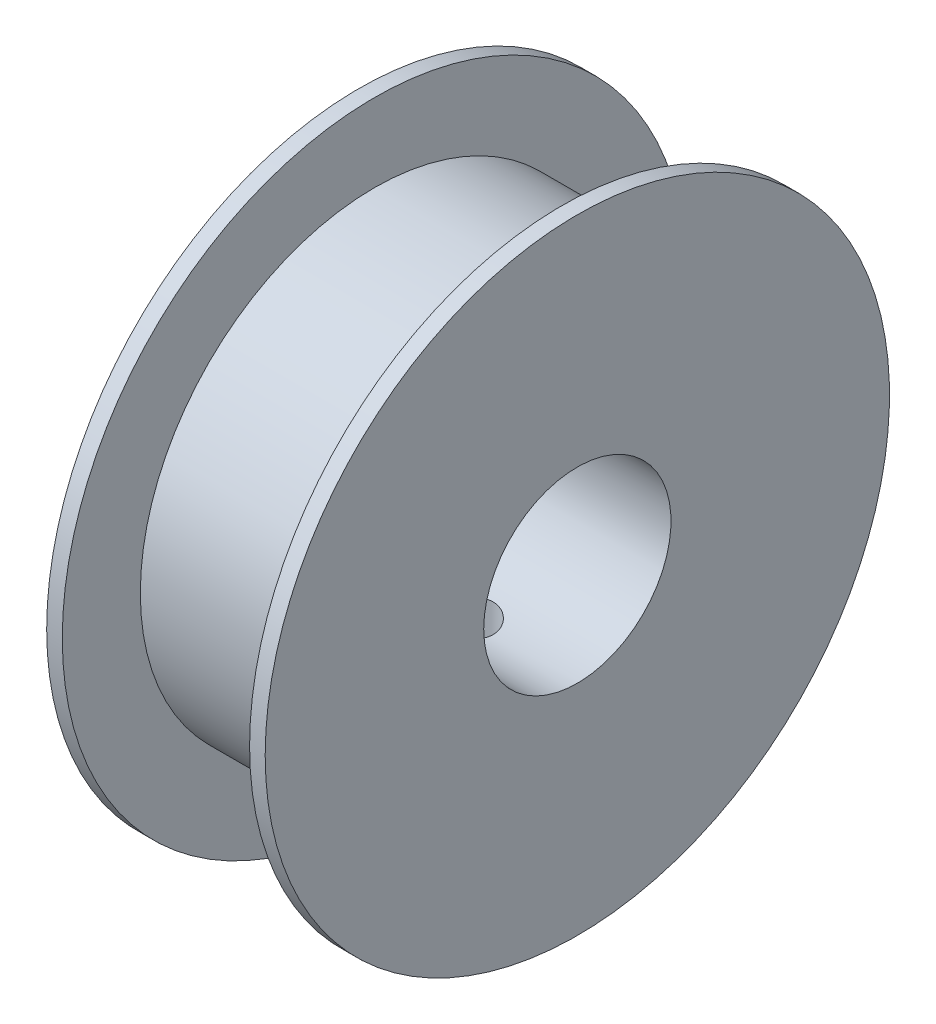
ISO-10303-21;
HEADER;
FILE_DESCRIPTION(('STEP AP214'),'2;1');
FILE_NAME('part.step','',(''),(''),'','','');
FILE_SCHEMA(('AUTOMOTIVE_DESIGN { 1 0 10303 214 1 1 1 1 }'));
ENDSEC;
DATA;
#1=APPLICATION_CONTEXT('core data for automotive mechanical design processes');
#2=APPLICATION_PROTOCOL_DEFINITION('international standard','automotive_design',2000,#1);
#3=PRODUCT_CONTEXT('',#1,'mechanical');
#4=PRODUCT('Part','Part','',(#3));
#5=PRODUCT_RELATED_PRODUCT_CATEGORY('part','',(#4));
#6=PRODUCT_DEFINITION_FORMATION('','',#4);
#7=PRODUCT_DEFINITION_CONTEXT('part definition',#1,'design');
#8=PRODUCT_DEFINITION('design','',#6,#7);
#9=PRODUCT_DEFINITION_SHAPE('','',#8);
#10=(LENGTH_UNIT() NAMED_UNIT(*) SI_UNIT(.MILLI.,.METRE.));
#11=(NAMED_UNIT(*) PLANE_ANGLE_UNIT() SI_UNIT($,.RADIAN.));
#12=(NAMED_UNIT(*) SI_UNIT($,.STERADIAN.) SOLID_ANGLE_UNIT());
#13=UNCERTAINTY_MEASURE_WITH_UNIT(LENGTH_MEASURE(1.E-05),#10,'distance_accuracy_value','');
#14=(GEOMETRIC_REPRESENTATION_CONTEXT(3) GLOBAL_UNCERTAINTY_ASSIGNED_CONTEXT((#13)) GLOBAL_UNIT_ASSIGNED_CONTEXT((#10,
#11,#12)) REPRESENTATION_CONTEXT('',''));
#15=CARTESIAN_POINT('',(0.,0.,0.));
#16=DIRECTION('',(0.,0.,1.));
#17=DIRECTION('',(1.,0.,0.));
#18=AXIS2_PLACEMENT_3D('',#15,#16,#17);
#19=CARTESIAN_POINT('',(-49.8494068842632,0.,20.0560361776407));
#20=DIRECTION('',(-1.,0.,0.));
#21=DIRECTION('',(0.,0.,1.));
#22=AXIS2_PLACEMENT_3D('',#19,#20,#21);
#23=CYLINDRICAL_SURFACE('',#22,20.);
#24=CARTESIAN_POINT('',(-44.7308545798672,0.,20.0560361776407));
#25=DIRECTION('',(-1.,0.,0.));
#26=DIRECTION('',(0.,0.,1.));
#27=AXIS2_PLACEMENT_3D('',#24,#25,#26);
#28=CIRCLE('',#27,20.);
#29=CARTESIAN_POINT('',(-44.7308545798672,0.,40.0560361776407));
#30=VERTEX_POINT('',#29);
#31=EDGE_CURVE('E65',#30,#30,#28,.T.);
#32=ORIENTED_EDGE('',*,*,#31,.F.);
#33=EDGE_LOOP('',(#32));
#34=FACE_BOUND('',#33,.T.);
#35=CARTESIAN_POINT('',(-43.7308545798672,0.,20.0560361776407));
#36=DIRECTION('',(-1.,0.,0.));
#37=DIRECTION('',(0.,0.,1.));
#38=AXIS2_PLACEMENT_3D('',#35,#36,#37);
#39=CIRCLE('',#38,20.);
#40=CARTESIAN_POINT('',(-43.7308545798672,0.,40.0560361776407));
#41=VERTEX_POINT('',#40);
#42=EDGE_CURVE('E10',#41,#41,#39,.T.);
#43=ORIENTED_EDGE('',*,*,#42,.T.);
#44=EDGE_LOOP('',(#43));
#45=FACE_BOUND('',#44,.T.);
#46=ADVANCED_FACE('F33',(#34,#45),#23,.T.);
#47=CARTESIAN_POINT('',(-43.7308545798672,0.,0.0560361776407448));
#48=DIRECTION('',(-1.,0.,0.));
#49=DIRECTION('',(0.,0.,1.));
#50=AXIS2_PLACEMENT_3D('',#47,#48,#49);
#51=PLANE('',#50);
#52=ORIENTED_EDGE('',*,*,#42,.F.);
#53=EDGE_LOOP('',(#52));
#54=FACE_BOUND('',#53,.T.);
#55=CARTESIAN_POINT('',(-43.7308545798672,0.,20.0560361776407));
#56=DIRECTION('',(-1.,0.,0.));
#57=DIRECTION('',(0.,0.,1.));
#58=AXIS2_PLACEMENT_3D('',#55,#56,#57);
#59=CIRCLE('',#58,15.);
#60=CARTESIAN_POINT('',(-43.7308545798672,0.,35.0560361776407));
#61=VERTEX_POINT('',#60);
#62=EDGE_CURVE('E44',#61,#61,#59,.T.);
#63=ORIENTED_EDGE('',*,*,#62,.T.);
#64=EDGE_LOOP('',(#63));
#65=FACE_BOUND('',#64,.T.);
#66=ADVANCED_FACE('F103',(#54,#65),#51,.F.);
#67=CARTESIAN_POINT('',(-49.8494068842632,0.,20.0560361776407));
#68=DIRECTION('',(-1.,0.,0.));
#69=DIRECTION('',(0.,0.,1.));
#70=AXIS2_PLACEMENT_3D('',#67,#68,#69);
#71=CYLINDRICAL_SURFACE('',#70,15.);
#72=CARTESIAN_POINT('',(-37.7308545798672,-14.9144225500017,21.6560361776407));
#73=CARTESIAN_POINT('',(-37.6412565888924,-14.9144236655933,21.6560323127364));
#74=CARTESIAN_POINT('',(-37.5516001486898,-14.9152386417625,21.6484847560006));
#75=CARTESIAN_POINT('',(-37.3747753240401,-14.9184098476283,21.6184913808744));
#76=CARTESIAN_POINT('',(-37.2876097544806,-14.9207677542496,21.5960293523893));
#77=CARTESIAN_POINT('',(-37.1183528283659,-14.9267547699762,21.5368705670349));
#78=CARTESIAN_POINT('',(-37.0362583425626,-14.9303830857339,21.5001826924183));
#79=CARTESIAN_POINT('',(-36.8794093412271,-14.9385011292845,21.4136312202387));
#80=CARTESIAN_POINT('',(-36.8046534216364,-14.9429906918111,21.3637701498155));
#81=CARTESIAN_POINT('',(-36.6642787395788,-14.9523460689031,21.2520673578389));
#82=CARTESIAN_POINT('',(-36.5986944731294,-14.9572132022761,21.1901823919092));
#83=CARTESIAN_POINT('',(-36.4788220851314,-14.9667633778283,21.0562811269401));
#84=CARTESIAN_POINT('',(-36.4245344912235,-14.9714464114003,20.9842643549312));
#85=CARTESIAN_POINT('',(-36.3286759368629,-14.9801139039792,20.8319308435279));
#86=CARTESIAN_POINT('',(-36.2871357055182,-14.9840966651839,20.7515946624799));
#87=CARTESIAN_POINT('',(-36.2181476904811,-14.9909004707378,20.585037492711));
#88=CARTESIAN_POINT('',(-36.1906995194533,-14.9937215470167,20.4988166658096));
#89=CARTESIAN_POINT('',(-36.1507764975354,-14.9978748574594,20.3232875577804));
#90=CARTESIAN_POINT('',(-36.1382447767579,-14.9992127450233,20.2339923472546));
#91=CARTESIAN_POINT('',(-36.1283343494322,-15.0002681826757,20.0545568302117));
#92=CARTESIAN_POINT('',(-36.1309552000684,-14.9999857801152,19.9644165484678));
#93=CARTESIAN_POINT('',(-36.1512295000159,-14.9978370703299,19.7862359121619));
#94=CARTESIAN_POINT('',(-36.168821795094,-14.9959772067036,19.6981885105843));
#95=CARTESIAN_POINT('',(-36.2184442527998,-14.9908899262437,19.5263031148105));
#96=CARTESIAN_POINT('',(-36.250474624907,-14.9876624895682,19.4424651817084));
#97=CARTESIAN_POINT('',(-36.3281305677545,-14.9801917630767,19.2811866509887));
#98=CARTESIAN_POINT('',(-36.3737830534523,-14.9759464654356,19.203759109756));
#99=CARTESIAN_POINT('',(-36.4773677663219,-14.9669160371749,19.0576417042459));
#100=CARTESIAN_POINT('',(-36.5353004035534,-14.962130888531,18.9889521318701));
#101=CARTESIAN_POINT('',(-36.662144514172,-14.9525292725756,18.8619020477762));
#102=CARTESIAN_POINT('',(-36.7311092110492,-14.9477127679481,18.803594663104));
#103=CARTESIAN_POINT('',(-36.877875674098,-14.9386149965148,18.699375784939));
#104=CARTESIAN_POINT('',(-36.9556774561651,-14.9343337306718,18.6534643137436));
#105=CARTESIAN_POINT('',(-37.1179520033578,-14.9267909175718,18.5753399745346));
#106=CARTESIAN_POINT('',(-37.2024264760579,-14.9235296323989,18.5431306265151));
#107=CARTESIAN_POINT('',(-37.3756272299974,-14.9184013871239,18.4933681173521));
#108=CARTESIAN_POINT('',(-37.4643533633038,-14.9165343785466,18.4758144466671));
#109=CARTESIAN_POINT('',(-37.6430717421569,-14.9144146003332,18.4559304092112));
#110=CARTESIAN_POINT('',(-37.7330556165361,-14.914153938196,18.4535256098236));
#111=CARTESIAN_POINT('',(-37.9121450214029,-14.9152555286042,18.4638118773613));
#112=CARTESIAN_POINT('',(-38.0012505654055,-14.9166177561386,18.4765027116408));
#113=CARTESIAN_POINT('',(-38.1758354801393,-14.9208044527218,18.5165576276903));
#114=CARTESIAN_POINT('',(-38.2613230649851,-14.9236253932699,18.5438863074639));
#115=CARTESIAN_POINT('',(-38.4265011121702,-14.9304088072498,18.6124049388579));
#116=CARTESIAN_POINT('',(-38.5061914240119,-14.9343713103036,18.6535952501712));
#117=CARTESIAN_POINT('',(-38.6578514629253,-14.9430104351993,18.7488535148471));
#118=CARTESIAN_POINT('',(-38.7297901321486,-14.9476897601603,18.8029706661976));
#119=CARTESIAN_POINT('',(-38.8635893871637,-14.9572265334338,18.9224761470013));
#120=CARTESIAN_POINT('',(-38.9254496886995,-14.9620839867655,18.9878647942552));
#121=CARTESIAN_POINT('',(-39.037594077137,-14.9714536371823,19.1283805843653));
#122=CARTESIAN_POINT('',(-39.0878295202163,-14.9759643325541,19.2035466635937));
#123=CARTESIAN_POINT('',(-39.1749630080714,-14.9841102341174,19.3612920433897));
#124=CARTESIAN_POINT('',(-39.2118612572873,-14.9877454537285,19.4438712303009));
#125=CARTESIAN_POINT('',(-39.2711910403719,-14.9937240629098,19.6139309143894));
#126=CARTESIAN_POINT('',(-39.2936516420748,-14.9960700467537,19.7014011755621));
#127=CARTESIAN_POINT('',(-39.3235633531027,-14.9992165342767,19.8788978045657));
#128=CARTESIAN_POINT('',(-39.3310149465423,-15.0000170878034,19.9689240898571));
#129=CARTESIAN_POINT('',(-39.3306897683637,-14.9999824379928,20.1485001655406));
#130=CARTESIAN_POINT('',(-39.3229883842556,-14.9991553324116,20.2380501035077));
#131=CARTESIAN_POINT('',(-39.2927343370414,-14.9959742980279,20.4145760913493));
#132=CARTESIAN_POINT('',(-39.2701816669227,-14.9936203685045,20.5015521400084));
#133=CARTESIAN_POINT('',(-39.2108868324186,-14.9876492980642,20.6704585051961));
#134=CARTESIAN_POINT('',(-39.1741472288251,-14.9840323851316,20.7523897292405));
#135=CARTESIAN_POINT('',(-39.0875293559588,-14.9759378682743,20.9089348387753));
#136=CARTESIAN_POINT('',(-39.0376511055162,-14.9714602655833,20.9835487347525));
#137=CARTESIAN_POINT('',(-38.9258898303516,-14.9621189097809,21.1237273565908));
#138=CARTESIAN_POINT('',(-38.8639506378233,-14.9572534154219,21.1892471864386));
#139=CARTESIAN_POINT('',(-38.7299386060694,-14.9476992164899,21.3089953406162));
#140=CARTESIAN_POINT('',(-38.6578633473456,-14.9430105544671,21.3632209613069));
#141=CARTESIAN_POINT('',(-38.5053963885181,-14.9343265816053,21.458966837947));
#142=CARTESIAN_POINT('',(-38.4249815241576,-14.9303332892578,21.5004503644136));
#143=CARTESIAN_POINT('',(-38.258334463341,-14.9235160982773,21.569269161836));
#144=CARTESIAN_POINT('',(-38.1721088938709,-14.9206908928619,21.5966202518801));
#145=CARTESIAN_POINT('',(-38.0263131951117,-14.9172357939645,21.6296435128485));
#146=CARTESIAN_POINT('',(-37.9676723529666,-14.9161858805251,21.6395270656153));
#147=CARTESIAN_POINT('',(-37.8496477639283,-14.9147788904034,21.6527246630897));
#148=CARTESIAN_POINT('',(-37.7902640207155,-14.9144218102902,21.65603874033));
#149=CARTESIAN_POINT('',(-37.7308545798672,-14.9144225500017,21.6560361776407));
#150=B_SPLINE_CURVE_WITH_KNOTS('',3,(#72,#73,#74,#75,#76,#77,#78,#79,#80,#81,#82,#83,#84,#85,
#86,#87,#88,#89,#90,#91,#92,#93,#94,#95,#96,#97,#98,#99,#100,#101,#102,#103,#104,#105,#106,#107,
#108,#109,#110,#111,#112,#113,#114,#115,#116,#117,#118,#119,#120,#121,#122,#123,#124,#125,#126,
#127,#128,#129,#130,#131,#132,#133,#134,#135,#136,#137,#138,#139,#140,#141,#142,#143,#144,#145,
#146,#147,#148,#149),.UNSPECIFIED.,.T.,.F.,(4,2,2,2,2,2,2,2,2,2,2,2,2,2,2,2,2,2,2,2,2,2,2,2,2,2,
2,2,2,2,2,2,2,2,2,2,2,2,4),(0.,0.268577001529124,0.537446390261954,0.806148173479042,
1.07479844645294,1.34443343913401,1.61408102300266,1.88437361023824,2.15465876779301,
2.42391011167973,2.69315358705864,2.96130252668383,3.22945535696219,3.49814155961667,
3.76683673567383,4.03686964273638,4.30690303552161,4.57700575645424,4.84709908619821,
5.11586429481954,5.3846253614294,5.65273933841567,5.92086027317743,6.19001837516274,
6.4591840673222,6.72945648996832,6.99972476955153,7.26944718972389,7.53916090987708,
7.80753617116474,8.07591155917663,8.34423852710792,8.61256511047858,8.88217254048789,
9.15184443588199,9.42228652782287,9.69242524206731,9.87051058001084,10.0485950360567),.UNSPECIFIED.);
#151=CARTESIAN_POINT('',(-37.7308545798672,-14.9144225500017,21.6560361776407));
#152=VERTEX_POINT('',#151);
#153=EDGE_CURVE('E68',#152,#152,#150,.T.);
#154=ORIENTED_EDGE('',*,*,#153,.T.);
#155=EDGE_LOOP('',(#154));
#156=FACE_BOUND('',#155,.T.);
#157=ORIENTED_EDGE('',*,*,#62,.F.);
#158=EDGE_LOOP('',(#157));
#159=FACE_BOUND('',#158,.T.);
#160=CARTESIAN_POINT('',(-31.7308545798672,0.,20.0560361776407));
#161=DIRECTION('',(-1.,0.,0.));
#162=DIRECTION('',(0.,0.,1.));
#163=AXIS2_PLACEMENT_3D('',#160,#161,#162);
#164=CIRCLE('',#163,15.);
#165=CARTESIAN_POINT('',(-31.7308545798672,0.,35.0560361776407));
#166=VERTEX_POINT('',#165);
#167=EDGE_CURVE('E48',#166,#166,#164,.T.);
#168=ORIENTED_EDGE('',*,*,#167,.T.);
#169=EDGE_LOOP('',(#168));
#170=FACE_BOUND('',#169,.T.);
#171=ADVANCED_FACE('F73',(#156,#159,#170),#71,.T.);
#172=CARTESIAN_POINT('',(-31.7308545798672,0.,5.05603617764075));
#173=DIRECTION('',(1.,0.,0.));
#174=DIRECTION('',(0.,0.,-1.));
#175=AXIS2_PLACEMENT_3D('',#172,#173,#174);
#176=PLANE('',#175);
#177=ORIENTED_EDGE('',*,*,#167,.F.);
#178=EDGE_LOOP('',(#177));
#179=FACE_BOUND('',#178,.T.);
#180=CARTESIAN_POINT('',(-31.7308545798672,0.,20.0560361776407));
#181=DIRECTION('',(-1.,0.,0.));
#182=DIRECTION('',(0.,0.,1.));
#183=AXIS2_PLACEMENT_3D('',#180,#181,#182);
#184=CIRCLE('',#183,20.);
#185=CARTESIAN_POINT('',(-31.7308545798672,0.,40.0560361776407));
#186=VERTEX_POINT('',#185);
#187=EDGE_CURVE('E53',#186,#186,#184,.T.);
#188=ORIENTED_EDGE('',*,*,#187,.T.);
#189=EDGE_LOOP('',(#188));
#190=FACE_BOUND('',#189,.T.);
#191=ADVANCED_FACE('F96',(#179,#190),#176,.F.);
#192=CARTESIAN_POINT('',(-49.8494068842632,0.,20.0560361776407));
#193=DIRECTION('',(-1.,0.,0.));
#194=DIRECTION('',(0.,0.,1.));
#195=AXIS2_PLACEMENT_3D('',#192,#193,#194);
#196=CYLINDRICAL_SURFACE('',#195,20.);
#197=ORIENTED_EDGE('',*,*,#187,.F.);
#198=EDGE_LOOP('',(#197));
#199=FACE_BOUND('',#198,.T.);
#200=CARTESIAN_POINT('',(-30.7308545798672,0.,20.0560361776407));
#201=DIRECTION('',(-1.,0.,0.));
#202=DIRECTION('',(0.,0.,1.));
#203=AXIS2_PLACEMENT_3D('',#200,#201,#202);
#204=CIRCLE('',#203,20.);
#205=CARTESIAN_POINT('',(-30.7308545798672,0.,40.0560361776407));
#206=VERTEX_POINT('',#205);
#207=EDGE_CURVE('E56',#206,#206,#204,.T.);
#208=ORIENTED_EDGE('',*,*,#207,.T.);
#209=EDGE_LOOP('',(#208));
#210=FACE_BOUND('',#209,.T.);
#211=ADVANCED_FACE('F93',(#199,#210),#196,.T.);
#212=CARTESIAN_POINT('',(-30.7308545798672,0.,0.0560361776407448));
#213=DIRECTION('',(-1.,0.,0.));
#214=DIRECTION('',(0.,0.,1.));
#215=AXIS2_PLACEMENT_3D('',#212,#213,#214);
#216=PLANE('',#215);
#217=ORIENTED_EDGE('',*,*,#207,.F.);
#218=EDGE_LOOP('',(#217));
#219=FACE_BOUND('',#218,.T.);
#220=CARTESIAN_POINT('',(-30.7308545798672,0.,20.0560361776407));
#221=DIRECTION('',(-1.,0.,0.));
#222=DIRECTION('',(0.,0.,1.));
#223=AXIS2_PLACEMENT_3D('',#220,#221,#222);
#224=CIRCLE('',#223,6.);
#225=CARTESIAN_POINT('',(-30.7308545798672,0.,26.0560361776408));
#226=VERTEX_POINT('',#225);
#227=EDGE_CURVE('E59',#226,#226,#224,.T.);
#228=ORIENTED_EDGE('',*,*,#227,.T.);
#229=EDGE_LOOP('',(#228));
#230=FACE_BOUND('',#229,.T.);
#231=ADVANCED_FACE('F89',(#219,#230),#216,.F.);
#232=CARTESIAN_POINT('',(-49.8494068842632,0.,20.0560361776407));
#233=DIRECTION('',(-1.,0.,0.));
#234=DIRECTION('',(0.,0.,1.));
#235=AXIS2_PLACEMENT_3D('',#232,#233,#234);
#236=CYLINDRICAL_SURFACE('',#235,6.);
#237=CARTESIAN_POINT('',(-37.7308545798672,-5.78273291792039,21.6560361776407));
#238=CARTESIAN_POINT('',(-37.8189953300582,-5.78273444556331,21.6560340521669));
#239=CARTESIAN_POINT('',(-37.9071585802477,-5.78477011639345,21.6487281234385));
#240=CARTESIAN_POINT('',(-38.0809389171126,-5.79266848924472,21.6197528437229));
#241=CARTESIAN_POINT('',(-38.1665547038497,-5.79853311126453,21.5980762866084));
#242=CARTESIAN_POINT('',(-38.3327010358245,-5.81337900141366,21.5411229421213));
#243=CARTESIAN_POINT('',(-38.4132385469299,-5.82235588547335,21.5058652779781));
#244=CARTESIAN_POINT('',(-38.5672679719151,-5.8424092393635,21.4228104541504));
#245=CARTESIAN_POINT('',(-38.6407593378728,-5.85348587227547,21.3750123203723));
#246=CARTESIAN_POINT('',(-38.7804486174574,-5.87680111642766,21.2669549606372));
#247=CARTESIAN_POINT('',(-38.8464441938388,-5.88906032893152,21.2064385576744));
#248=CARTESIAN_POINT('',(-38.9674798414282,-5.91318161149208,21.0752155959129));
#249=CARTESIAN_POINT('',(-39.0225187767806,-5.92504364026752,21.0045079819181));
#250=CARTESIAN_POINT('',(-39.1209225305896,-5.94726390774734,20.8535067143394));
#251=CARTESIAN_POINT('',(-39.1640861947735,-5.95759501009834,20.7730776335443));
#252=CARTESIAN_POINT('',(-39.236202288161,-5.97535300969468,20.605782613424));
#253=CARTESIAN_POINT('',(-39.2651571136925,-5.9827803966101,20.5189177623408));
#254=CARTESIAN_POINT('',(-39.3073787560558,-5.99374842861169,20.3433289470888));
#255=CARTESIAN_POINT('',(-39.3209897611679,-5.99737421400212,20.2546931570015));
#256=CARTESIAN_POINT('',(-39.3332202759529,-6.000628196942,20.0763270204476));
#257=CARTESIAN_POINT('',(-39.3318422947713,-6.00025706357286,19.9865968596899));
#258=CARTESIAN_POINT('',(-39.3143763298356,-5.99562140687813,19.8109847879517));
#259=CARTESIAN_POINT('',(-39.2986602137582,-5.99145531221602,19.7250628970639));
#260=CARTESIAN_POINT('',(-39.2535648696417,-5.97981398872374,19.5571231251839));
#261=CARTESIAN_POINT('',(-39.2241848625184,-5.97233857120463,19.4751054670963));
#262=CARTESIAN_POINT('',(-39.1523107017933,-5.95477255279923,19.3163530215227));
#263=CARTESIAN_POINT('',(-39.1096891341867,-5.94465670302171,19.2396788285771));
#264=CARTESIAN_POINT('',(-39.0126395242599,-5.9228997480757,19.0944441786291));
#265=CARTESIAN_POINT('',(-38.9582091806447,-5.91125834578275,19.0258853071721));
#266=CARTESIAN_POINT('',(-38.8371130935201,-5.88729018351104,18.8966078820683));
#267=CARTESIAN_POINT('',(-38.7701230238277,-5.87495335495478,18.8361946414986));
#268=CARTESIAN_POINT('',(-38.6268348388762,-5.85130724018329,18.7273855208026));
#269=CARTESIAN_POINT('',(-38.550536156507,-5.83999801664632,18.6789903734023));
#270=CARTESIAN_POINT('',(-38.3901344984101,-5.81964721826454,18.5953587441505));
#271=CARTESIAN_POINT('',(-38.3059862991363,-5.81062005680583,18.5602052448365));
#272=CARTESIAN_POINT('',(-38.1326733803037,-5.79603460063156,18.5046441641554));
#273=CARTESIAN_POINT('',(-38.0435099107085,-5.79047544571885,18.4842329259503));
#274=CARTESIAN_POINT('',(-37.8655528110499,-5.78363868515234,18.4592621208986));
#275=CARTESIAN_POINT('',(-37.7768277409786,-5.78223810662158,18.454247116671));
#276=CARTESIAN_POINT('',(-37.5998067616252,-5.78354062803713,18.4589563286567));
#277=CARTESIAN_POINT('',(-37.5115108076735,-5.78624329125357,18.468678976263));
#278=CARTESIAN_POINT('',(-37.3396093045891,-5.79532899431386,18.5021860026814));
#279=CARTESIAN_POINT('',(-37.2559462295161,-5.80164031753083,18.5256965943375));
#280=CARTESIAN_POINT('',(-37.0937508747806,-5.81716215168585,18.5858042838368));
#281=CARTESIAN_POINT('',(-37.0152192667256,-5.82637304120572,18.6224030906275));
#282=CARTESIAN_POINT('',(-36.8636106139187,-5.84690857976629,18.7085729335711));
#283=CARTESIAN_POINT('',(-36.7906913991553,-5.8582752389782,18.7584114157374));
#284=CARTESIAN_POINT('',(-36.6540839385048,-5.88174273547405,18.8693143537406));
#285=CARTESIAN_POINT('',(-36.5903974319039,-5.89384371048319,18.930380919857));
#286=CARTESIAN_POINT('',(-36.4721726012672,-5.91783971907433,19.0641131516369));
#287=CARTESIAN_POINT('',(-36.4179518782843,-5.92971869219044,19.1370630448337));
#288=CARTESIAN_POINT('',(-36.3225257899388,-5.95157336013737,19.2912934288881));
#289=CARTESIAN_POINT('',(-36.2813197318041,-5.96154915626333,19.3725734760256));
#290=CARTESIAN_POINT('',(-36.213470873978,-5.978409207194,19.54058486978));
#291=CARTESIAN_POINT('',(-36.1867193643124,-5.98531646784308,19.6272698953349));
#292=CARTESIAN_POINT('',(-36.1482235974157,-5.99536243029798,19.8041166698557));
#293=CARTESIAN_POINT('',(-36.1364760144475,-5.99850196723977,19.8942776437845));
#294=CARTESIAN_POINT('',(-36.1285299208741,-6.00061930750161,20.0725497787177));
#295=CARTESIAN_POINT('',(-36.1318655245623,-5.99972181030495,20.160638986863));
#296=CARTESIAN_POINT('',(-36.1529093747274,-5.9941479278306,20.3349548213453));
#297=CARTESIAN_POINT('',(-36.1706170815607,-5.98947168443723,20.4211815174909));
#298=CARTESIAN_POINT('',(-36.2196390638022,-5.97689048312844,20.5887642764122));
#299=CARTESIAN_POINT('',(-36.2508588146455,-5.96900797751776,20.6701497871222));
#300=CARTESIAN_POINT('',(-36.3259342612638,-5.95083853212804,20.8265738564176));
#301=CARTESIAN_POINT('',(-36.3697917291561,-5.9405512551794,20.9016115229695));
#302=CARTESIAN_POINT('',(-36.4702611975783,-5.918330649808,21.0453787925806));
#303=CARTESIAN_POINT('',(-36.5271820844316,-5.90636074702983,21.113886867031));
#304=CARTESIAN_POINT('',(-36.6515767793537,-5.8822720005613,21.2405364748862));
#305=CARTESIAN_POINT('',(-36.7190533605023,-5.87015311850574,21.2986752755716));
#306=CARTESIAN_POINT('',(-36.8644292965397,-5.84683167732793,21.4042017795134));
#307=CARTESIAN_POINT('',(-36.9425252308664,-5.83565513061492,21.4513249317798));
#308=CARTESIAN_POINT('',(-37.1058196286297,-5.81585115203584,21.5317056899304));
#309=CARTESIAN_POINT('',(-37.191013402719,-5.80722205399804,21.5649723645919));
#310=CARTESIAN_POINT('',(-37.3517196486944,-5.79468800506477,21.612341171651));
#311=CARTESIAN_POINT('',(-37.4265355915089,-5.79024112213281,21.6286883248341));
#312=CARTESIAN_POINT('',(-37.5778470262661,-5.78426308173731,21.6505361319943));
#313=CARTESIAN_POINT('',(-37.6543423256993,-5.78273159182091,21.6560380226988));
#314=CARTESIAN_POINT('',(-37.7308545798672,-5.78273291792039,21.6560361776407));
#315=B_SPLINE_CURVE_WITH_KNOTS('',3,(#237,#238,#239,#240,#241,#242,#243,#244,#245,#246,#247,
#248,#249,#250,#251,#252,#253,#254,#255,#256,#257,#258,#259,#260,#261,#262,#263,#264,#265,#266,
#267,#268,#269,#270,#271,#272,#273,#274,#275,#276,#277,#278,#279,#280,#281,#282,#283,#284,#285,
#286,#287,#288,#289,#290,#291,#292,#293,#294,#295,#296,#297,#298,#299,#300,#301,#302,#303,#304,
#305,#306,#307,#308,#309,#310,#311,#312,#313,#314),.UNSPECIFIED.,.T.,.F.,(4,2,2,2,2,2,2,2,2,2,2,
2,2,2,2,2,2,2,2,2,2,2,2,2,2,2,2,2,2,2,2,2,2,2,2,2,2,2,4),(0.,0.264140902492817,
0.528414358280157,0.792317049276922,1.05624024524883,1.32612732904168,1.59604237699568,
1.87028165896642,2.14447467443396,2.41238643453184,2.68025334708482,2.94136456640642,
3.20249067552555,3.46621159124455,3.72998394715592,4.00185409840263,4.27374082111662,
4.54730412077228,4.82079953934805,5.08612267391535,5.35141757070657,5.61161480341914,
5.87184602287713,6.13779707970072,6.40379817229034,6.67748725563561,6.95116176802337,
7.22274831668975,7.49427465563059,7.75747243929024,8.02066034086224,8.28203611890786,
8.54344856608625,8.81183083189115,9.08028372300692,9.35464031183426,9.62881705674849,
9.85813574131029,10.0874282742632),.UNSPECIFIED.);
#316=CARTESIAN_POINT('',(-37.7308545798672,-5.78273291792039,21.6560361776407));
#317=VERTEX_POINT('',#316);
#318=EDGE_CURVE('E36',#317,#317,#315,.T.);
#319=ORIENTED_EDGE('',*,*,#318,.T.);
#320=EDGE_LOOP('',(#319));
#321=FACE_BOUND('',#320,.T.);
#322=ORIENTED_EDGE('',*,*,#227,.F.);
#323=EDGE_LOOP('',(#322));
#324=FACE_BOUND('',#323,.T.);
#325=CARTESIAN_POINT('',(-44.7308545798672,0.,20.0560361776407));
#326=DIRECTION('',(-1.,0.,0.));
#327=DIRECTION('',(0.,0.,1.));
#328=AXIS2_PLACEMENT_3D('',#325,#326,#327);
#329=CIRCLE('',#328,6.);
#330=CARTESIAN_POINT('',(-44.7308545798672,0.,26.0560361776408));
#331=VERTEX_POINT('',#330);
#332=EDGE_CURVE('E62',#331,#331,#329,.T.);
#333=ORIENTED_EDGE('',*,*,#332,.T.);
#334=EDGE_LOOP('',(#333));
#335=FACE_BOUND('',#334,.T.);
#336=ADVANCED_FACE('F84',(#321,#324,#335),#236,.F.);
#337=CARTESIAN_POINT('',(-44.7308545798672,0.,0.0560361776407448));
#338=DIRECTION('',(1.,0.,0.));
#339=DIRECTION('',(0.,0.,-1.));
#340=AXIS2_PLACEMENT_3D('',#337,#338,#339);
#341=PLANE('',#340);
#342=ORIENTED_EDGE('',*,*,#332,.F.);
#343=EDGE_LOOP('',(#342));
#344=FACE_BOUND('',#343,.T.);
#345=ORIENTED_EDGE('',*,*,#31,.T.);
#346=EDGE_LOOP('',(#345));
#347=FACE_BOUND('',#346,.T.);
#348=ADVANCED_FACE('F80',(#344,#347),#341,.F.);
#349=CARTESIAN_POINT('',(-37.7308545798672,-20.,20.0560361776407));
#350=DIRECTION('',(0.,1.,0.));
#351=DIRECTION('',(0.,0.,1.));
#352=AXIS2_PLACEMENT_3D('',#349,#350,#351);
#353=CYLINDRICAL_SURFACE('',#352,1.6);
#354=ORIENTED_EDGE('',*,*,#318,.F.);
#355=EDGE_LOOP('',(#354));
#356=FACE_BOUND('',#355,.T.);
#357=ORIENTED_EDGE('',*,*,#153,.F.);
#358=EDGE_LOOP('',(#357));
#359=FACE_BOUND('',#358,.T.);
#360=ADVANCED_FACE('F76',(#356,#359),#353,.F.);
#361=CLOSED_SHELL('',(#46,#66,#171,#191,#211,#231,#336,#348,#360));
#362=MANIFOLD_SOLID_BREP('B2',#361);
#363=ADVANCED_BREP_SHAPE_REPRESENTATION('',(#18,#362),#14);
#364=SHAPE_DEFINITION_REPRESENTATION(#9,#363);
ENDSEC;
END-ISO-10303-21;
